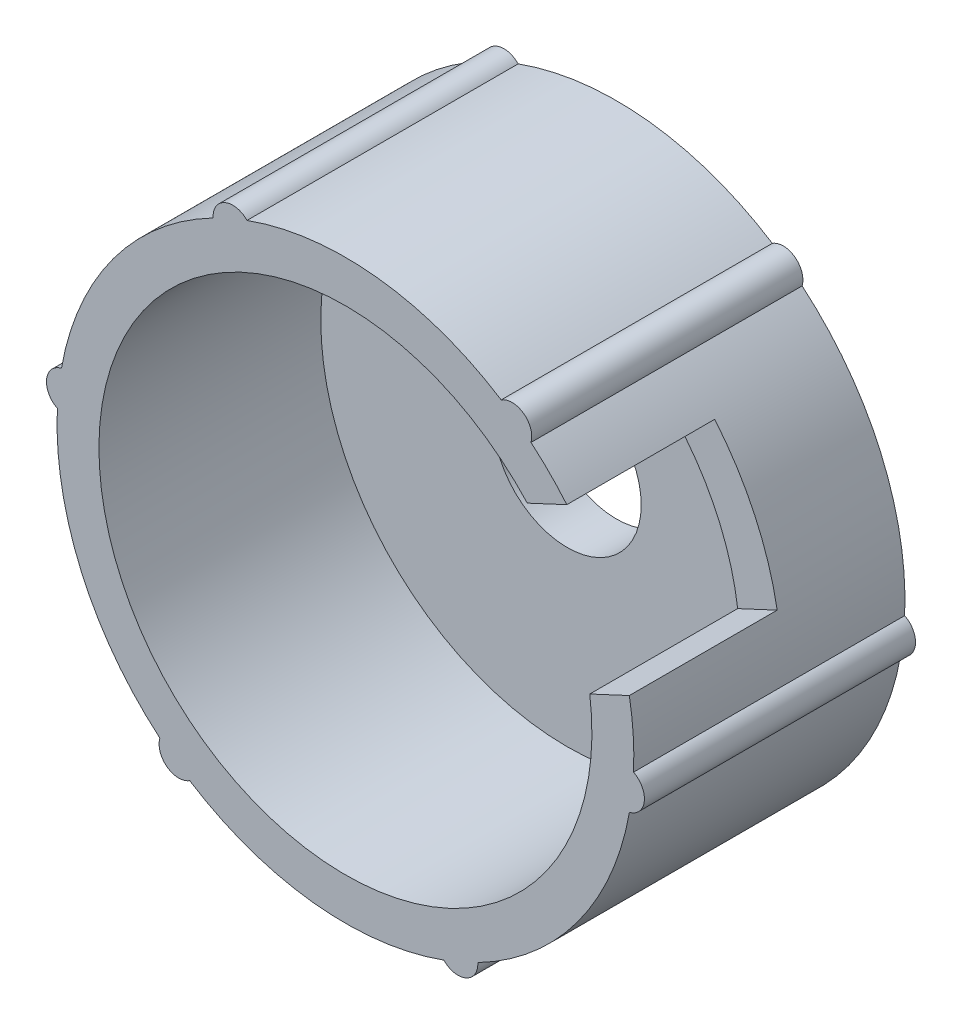
ISO-10303-21;
HEADER;
FILE_DESCRIPTION(('STEP AP214'),'2;1');
FILE_NAME('part.step','',(''),(''),'','','');
FILE_SCHEMA(('AUTOMOTIVE_DESIGN { 1 0 10303 214 1 1 1 1 }'));
ENDSEC;
DATA;
#1=APPLICATION_CONTEXT('core data for automotive mechanical design processes');
#2=APPLICATION_PROTOCOL_DEFINITION('international standard','automotive_design',2000,#1);
#3=PRODUCT_CONTEXT('',#1,'mechanical');
#4=PRODUCT('Part','Part','',(#3));
#5=PRODUCT_RELATED_PRODUCT_CATEGORY('part','',(#4));
#6=PRODUCT_DEFINITION_FORMATION('','',#4);
#7=PRODUCT_DEFINITION_CONTEXT('part definition',#1,'design');
#8=PRODUCT_DEFINITION('design','',#6,#7);
#9=PRODUCT_DEFINITION_SHAPE('','',#8);
#10=(LENGTH_UNIT() NAMED_UNIT(*) SI_UNIT(.MILLI.,.METRE.));
#11=(NAMED_UNIT(*) PLANE_ANGLE_UNIT() SI_UNIT($,.RADIAN.));
#12=(NAMED_UNIT(*) SI_UNIT($,.STERADIAN.) SOLID_ANGLE_UNIT());
#13=UNCERTAINTY_MEASURE_WITH_UNIT(LENGTH_MEASURE(1.E-05),#10,'distance_accuracy_value','');
#14=(GEOMETRIC_REPRESENTATION_CONTEXT(3) GLOBAL_UNCERTAINTY_ASSIGNED_CONTEXT((#13)) GLOBAL_UNIT_ASSIGNED_CONTEXT((#10,
#11,#12)) REPRESENTATION_CONTEXT('',''));
#15=CARTESIAN_POINT('',(0.,0.,0.));
#16=DIRECTION('',(0.,0.,1.));
#17=DIRECTION('',(1.,0.,0.));
#18=AXIS2_PLACEMENT_3D('',#15,#16,#17);
#19=CARTESIAN_POINT('',(94.,7.,29.9462986797652));
#20=DIRECTION('',(0.,0.,-1.));
#21=DIRECTION('',(-1.,0.,0.));
#22=AXIS2_PLACEMENT_3D('',#19,#20,#21);
#23=CYLINDRICAL_SURFACE('',#22,5.85);
#24=CARTESIAN_POINT('',(94.,7.,13.4));
#25=DIRECTION('',(0.,0.,1.));
#26=DIRECTION('',(1.,0.,0.));
#27=AXIS2_PLACEMENT_3D('',#24,#25,#26);
#28=CIRCLE('',#27,5.85);
#29=CARTESIAN_POINT('',(98.4907202465297,10.7491241200323,13.4));
#30=VERTEX_POINT('',#29);
#31=CARTESIAN_POINT('',(97.7638133414404,11.4784159175757,13.4));
#32=VERTEX_POINT('',#31);
#33=EDGE_CURVE('E177',#30,#32,#28,.T.);
#34=ORIENTED_EDGE('',*,*,#33,.F.);
#35=DIRECTION('',(0.,0.,-1.));
#36=VECTOR('',#35,1.);
#37=CARTESIAN_POINT('',(98.4907202465297,10.7491241200323,29.9462986797652));
#38=LINE('',#37,#36);
#39=CARTESIAN_POINT('',(98.4907202465297,10.7491241200323,10.4));
#40=VERTEX_POINT('',#39);
#41=EDGE_CURVE('E216',#30,#40,#38,.T.);
#42=ORIENTED_EDGE('',*,*,#41,.T.);
#43=CARTESIAN_POINT('',(94.,7.,10.4));
#44=DIRECTION('',(0.,0.,-1.));
#45=DIRECTION('',(-1.,0.,0.));
#46=AXIS2_PLACEMENT_3D('',#43,#44,#45);
#47=CIRCLE('',#46,5.85);
#48=CARTESIAN_POINT('',(99.7585750317518,8.03020075892235,10.4));
#49=VERTEX_POINT('',#48);
#50=EDGE_CURVE('E168',#40,#49,#47,.T.);
#51=ORIENTED_EDGE('',*,*,#50,.T.);
#52=DIRECTION('',(0.,0.,-1.));
#53=VECTOR('',#52,1.);
#54=CARTESIAN_POINT('',(99.7585750317518,8.03020075892235,29.9462986797652));
#55=LINE('',#54,#53);
#56=CARTESIAN_POINT('',(99.7585750317519,8.03020075892235,13.4));
#57=VERTEX_POINT('',#56);
#58=EDGE_CURVE('E154',#49,#57,#55,.F.);
#59=ORIENTED_EDGE('',*,*,#58,.T.);
#60=CARTESIAN_POINT('',(99.8435773086738,6.72594847646342,13.4));
#61=VERTEX_POINT('',#60);
#62=EDGE_CURVE('E166',#61,#57,#28,.T.);
#63=ORIENTED_EDGE('',*,*,#62,.F.);
#64=DIRECTION('',(0.,0.,-1.));
#65=VECTOR('',#64,1.);
#66=CARTESIAN_POINT('',(99.8435773086738,6.72594847646342,10.65));
#67=LINE('',#66,#65);
#68=CARTESIAN_POINT('',(99.8435773086738,6.72594847646342,7.9));
#69=VERTEX_POINT('',#68);
#70=EDGE_CURVE('E258',#69,#61,#67,.F.);
#71=ORIENTED_EDGE('',*,*,#70,.F.);
#72=CARTESIAN_POINT('',(94.,7.,7.9));
#73=DIRECTION('',(0.,0.,1.));
#74=DIRECTION('',(1.,0.,0.));
#75=AXIS2_PLACEMENT_3D('',#72,#73,#74);
#76=CIRCLE('',#75,5.85);
#77=CARTESIAN_POINT('',(97.7638133414404,11.4784159175757,7.9));
#78=VERTEX_POINT('',#77);
#79=EDGE_CURVE('E197',#69,#78,#76,.T.);
#80=ORIENTED_EDGE('',*,*,#79,.T.);
#81=DIRECTION('',(0.,0.,-1.));
#82=VECTOR('',#81,1.);
#83=CARTESIAN_POINT('',(97.7638133414404,11.4784159175757,10.65));
#84=LINE('',#83,#82);
#85=EDGE_CURVE('E264',#32,#78,#84,.T.);
#86=ORIENTED_EDGE('',*,*,#85,.F.);
#87=EDGE_LOOP('',(#34,#42,#51,#59,#63,#71,#80,#86));
#88=FACE_BOUND('',#87,.T.);
#89=ADVANCED_FACE('F41',(#88),#23,.T.);
#90=DIRECTION('',(0.,0.,-1.));
#91=VECTOR('',#90,1.);
#92=CARTESIAN_POINT('',(97.1591242356654,11.9236606365215,10.65));
#93=LINE('',#92,#91);
#94=CARTESIAN_POINT('',(97.1591242356654,11.9236606365215,7.9));
#95=VERTEX_POINT('',#94);
#96=CARTESIAN_POINT('',(97.1591242356654,11.9236606365215,13.4));
#97=VERTEX_POINT('',#96);
#98=EDGE_CURVE('E262',#95,#97,#93,.F.);
#99=ORIENTED_EDGE('',*,*,#98,.F.);
#100=CARTESIAN_POINT('',(92.003484717387,12.498765927578,7.9));
#101=VERTEX_POINT('',#100);
#102=EDGE_CURVE('E189',#95,#101,#76,.T.);
#103=ORIENTED_EDGE('',*,*,#102,.T.);
#104=DIRECTION('',(0.,0.,-1.));
#105=VECTOR('',#104,1.);
#106=CARTESIAN_POINT('',(92.003484717387,12.498765927578,10.65));
#107=LINE('',#106,#105);
#108=CARTESIAN_POINT('',(92.003484717387,12.498765927578,13.4));
#109=VERTEX_POINT('',#108);
#110=EDGE_CURVE('E206',#109,#101,#107,.T.);
#111=ORIENTED_EDGE('',*,*,#110,.F.);
#112=EDGE_CURVE('E179',#97,#109,#28,.T.);
#113=ORIENTED_EDGE('',*,*,#112,.F.);
#114=EDGE_LOOP('',(#99,#103,#111,#113));
#115=FACE_BOUND('',#114,.T.);
#116=ADVANCED_FACE('F308',(#115),#23,.T.);
#117=DIRECTION('',(0.,0.,-1.));
#118=VECTOR('',#117,1.);
#119=CARTESIAN_POINT('',(99.7603286240533,5.97964998999768,10.65));
#120=LINE('',#119,#118);
#121=CARTESIAN_POINT('',(99.7603286240533,5.97964998999768,13.4));
#122=VERTEX_POINT('',#121);
#123=CARTESIAN_POINT('',(99.7603286240533,5.97964998999768,7.9));
#124=VERTEX_POINT('',#123);
#125=EDGE_CURVE('E260',#122,#124,#120,.T.);
#126=ORIENTED_EDGE('',*,*,#125,.F.);
#127=CARTESIAN_POINT('',(96.6844530730084,1.80228783994192,13.4));
#128=VERTEX_POINT('',#127);
#129=EDGE_CURVE('E176',#128,#122,#28,.T.);
#130=ORIENTED_EDGE('',*,*,#129,.F.);
#131=DIRECTION('',(0.,0.,-1.));
#132=VECTOR('',#131,1.);
#133=CARTESIAN_POINT('',(96.6844530730084,1.80228783994192,10.65));
#134=LINE('',#133,#132);
#135=CARTESIAN_POINT('',(96.6844530730084,1.80228783994192,7.9));
#136=VERTEX_POINT('',#135);
#137=EDGE_CURVE('E253',#136,#128,#134,.F.);
#138=ORIENTED_EDGE('',*,*,#137,.F.);
#139=EDGE_CURVE('E205',#136,#124,#76,.T.);
#140=ORIENTED_EDGE('',*,*,#139,.T.);
#141=EDGE_LOOP('',(#126,#130,#138,#140));
#142=FACE_BOUND('',#141,.T.);
#143=ADVANCED_FACE('F300',(#142),#23,.T.);
#144=DIRECTION('',(0.,0.,-1.));
#145=VECTOR('',#144,1.);
#146=CARTESIAN_POINT('',(95.996515282613,1.501234072422,10.65));
#147=LINE('',#146,#145);
#148=CARTESIAN_POINT('',(95.996515282613,1.501234072422,13.4));
#149=VERTEX_POINT('',#148);
#150=CARTESIAN_POINT('',(95.996515282613,1.501234072422,7.9));
#151=VERTEX_POINT('',#150);
#152=EDGE_CURVE('E256',#149,#151,#147,.T.);
#153=ORIENTED_EDGE('',*,*,#152,.F.);
#154=CARTESIAN_POINT('',(90.8408757643346,2.0763393634785,13.4));
#155=VERTEX_POINT('',#154);
#156=EDGE_CURVE('E180',#155,#149,#28,.T.);
#157=ORIENTED_EDGE('',*,*,#156,.F.);
#158=DIRECTION('',(0.,0.,-1.));
#159=VECTOR('',#158,1.);
#160=CARTESIAN_POINT('',(90.8408757643346,2.07633936347851,10.65));
#161=LINE('',#160,#159);
#162=CARTESIAN_POINT('',(90.8408757643346,2.07633936347851,7.9));
#163=VERTEX_POINT('',#162);
#164=EDGE_CURVE('E248',#163,#155,#161,.F.);
#165=ORIENTED_EDGE('',*,*,#164,.F.);
#166=EDGE_CURVE('E195',#163,#151,#76,.T.);
#167=ORIENTED_EDGE('',*,*,#166,.T.);
#168=EDGE_LOOP('',(#153,#157,#165,#167));
#169=FACE_BOUND('',#168,.T.);
#170=ADVANCED_FACE('F285',(#169),#23,.T.);
#171=DIRECTION('',(0.,0.,-1.));
#172=VECTOR('',#171,1.);
#173=CARTESIAN_POINT('',(90.2361866585596,2.52158408242433,10.65));
#174=LINE('',#173,#172);
#175=CARTESIAN_POINT('',(90.2361866585596,2.52158408242433,13.4));
#176=VERTEX_POINT('',#175);
#177=CARTESIAN_POINT('',(90.2361866585596,2.52158408242433,7.9));
#178=VERTEX_POINT('',#177);
#179=EDGE_CURVE('E251',#176,#178,#174,.T.);
#180=ORIENTED_EDGE('',*,*,#179,.F.);
#181=CARTESIAN_POINT('',(88.1564226913262,7.27405152353661,13.4));
#182=VERTEX_POINT('',#181);
#183=EDGE_CURVE('E277',#182,#176,#28,.T.);
#184=ORIENTED_EDGE('',*,*,#183,.F.);
#185=DIRECTION('',(0.,0.,-1.));
#186=VECTOR('',#185,1.);
#187=CARTESIAN_POINT('',(88.1564226913262,7.27405152353662,10.65));
#188=LINE('',#187,#186);
#189=CARTESIAN_POINT('',(88.1564226913262,7.27405152353662,7.9));
#190=VERTEX_POINT('',#189);
#191=EDGE_CURVE('E229',#190,#182,#188,.F.);
#192=ORIENTED_EDGE('',*,*,#191,.F.);
#193=EDGE_CURVE('E188',#190,#178,#76,.T.);
#194=ORIENTED_EDGE('',*,*,#193,.T.);
#195=EDGE_LOOP('',(#180,#184,#192,#194));
#196=FACE_BOUND('',#195,.T.);
#197=ADVANCED_FACE('F316',(#196),#23,.T.);
#198=DIRECTION('',(0.,0.,-1.));
#199=VECTOR('',#198,1.);
#200=CARTESIAN_POINT('',(88.2396713759467,8.02035001000236,10.65));
#201=LINE('',#200,#199);
#202=CARTESIAN_POINT('',(88.2396713759467,8.02035001000236,13.4));
#203=VERTEX_POINT('',#202);
#204=CARTESIAN_POINT('',(88.2396713759467,8.02035001000236,7.9));
#205=VERTEX_POINT('',#204);
#206=EDGE_CURVE('E246',#203,#205,#201,.T.);
#207=ORIENTED_EDGE('',*,*,#206,.F.);
#208=CARTESIAN_POINT('',(91.3155469269916,12.1977121600581,13.4));
#209=VERTEX_POINT('',#208);
#210=EDGE_CURVE('E181',#209,#203,#28,.T.);
#211=ORIENTED_EDGE('',*,*,#210,.F.);
#212=DIRECTION('',(0.,0.,-1.));
#213=VECTOR('',#212,1.);
#214=CARTESIAN_POINT('',(91.3155469269916,12.1977121600581,10.65));
#215=LINE('',#214,#213);
#216=CARTESIAN_POINT('',(91.3155469269916,12.1977121600581,7.9));
#217=VERTEX_POINT('',#216);
#218=EDGE_CURVE('E209',#217,#209,#215,.F.);
#219=ORIENTED_EDGE('',*,*,#218,.F.);
#220=EDGE_CURVE('E184',#217,#205,#76,.T.);
#221=ORIENTED_EDGE('',*,*,#220,.T.);
#222=EDGE_LOOP('',(#207,#211,#219,#221));
#223=FACE_BOUND('',#222,.T.);
#224=ADVANCED_FACE('F276',(#223),#23,.T.);
#225=CARTESIAN_POINT('',(0.,0.,8.9));
#226=DIRECTION('',(0.,0.,1.));
#227=DIRECTION('',(1.,0.,0.));
#228=AXIS2_PLACEMENT_3D('',#225,#226,#227);
#229=PLANE('',#228);
#230=CARTESIAN_POINT('',(94.,7.,8.9));
#231=DIRECTION('',(0.,0.,1.));
#232=DIRECTION('',(1.,0.,0.));
#233=AXIS2_PLACEMENT_3D('',#230,#231,#232);
#234=CIRCLE('',#233,1.5);
#235=CARTESIAN_POINT('',(95.5,7.,8.9));
#236=VERTEX_POINT('',#235);
#237=EDGE_CURVE('E481',#236,#236,#234,.F.);
#238=ORIENTED_EDGE('',*,*,#237,.T.);
#239=EDGE_LOOP('',(#238));
#240=FACE_BOUND('',#239,.T.);
#241=CARTESIAN_POINT('',(94.,7.,8.9));
#242=DIRECTION('',(0.,0.,1.));
#243=DIRECTION('',(1.,0.,0.));
#244=AXIS2_PLACEMENT_3D('',#241,#242,#243);
#245=CIRCLE('',#244,4.99999999999999);
#246=CARTESIAN_POINT('',(99.,7.,8.9));
#247=VERTEX_POINT('',#246);
#248=EDGE_CURVE('E159',#247,#247,#245,.F.);
#249=ORIENTED_EDGE('',*,*,#248,.F.);
#250=EDGE_LOOP('',(#249));
#251=FACE_BOUND('',#250,.T.);
#252=ADVANCED_FACE('F334',(#240,#251),#229,.T.);
#253=CARTESIAN_POINT('',(94.,7.,29.9462986797652));
#254=DIRECTION('',(0.,0.,-1.));
#255=DIRECTION('',(-1.,0.,0.));
#256=AXIS2_PLACEMENT_3D('',#253,#254,#255);
#257=CYLINDRICAL_SURFACE('',#256,4.99999999999999);
#258=DIRECTION('',(0.,0.,-1.));
#259=VECTOR('',#258,1.);
#260=CARTESIAN_POINT('',(97.6888852404074,10.3752223161007,29.9462986797652));
#261=LINE('',#260,#259);
#262=CARTESIAN_POINT('',(97.6888852404074,10.3752223161007,13.4));
#263=VERTEX_POINT('',#262);
#264=CARTESIAN_POINT('',(97.6888852404074,10.3752223161007,10.4));
#265=VERTEX_POINT('',#264);
#266=EDGE_CURVE('E169',#263,#265,#261,.T.);
#267=ORIENTED_EDGE('',*,*,#266,.F.);
#268=CARTESIAN_POINT('',(94.,7.,13.4));
#269=DIRECTION('',(0.,0.,1.));
#270=DIRECTION('',(1.,0.,0.));
#271=AXIS2_PLACEMENT_3D('',#268,#269,#270);
#272=CIRCLE('',#271,4.99999999999999);
#273=CARTESIAN_POINT('',(98.9567400256295,7.65629895499074,13.4));
#274=VERTEX_POINT('',#273);
#275=EDGE_CURVE('E198',#263,#274,#272,.T.);
#276=ORIENTED_EDGE('',*,*,#275,.T.);
#277=DIRECTION('',(0.,0.,-1.));
#278=VECTOR('',#277,1.);
#279=CARTESIAN_POINT('',(98.9567400256295,7.65629895499075,29.9462986797652));
#280=LINE('',#279,#278);
#281=CARTESIAN_POINT('',(98.9567400256295,7.65629895499075,10.4));
#282=VERTEX_POINT('',#281);
#283=EDGE_CURVE('E56',#282,#274,#280,.F.);
#284=ORIENTED_EDGE('',*,*,#283,.F.);
#285=CARTESIAN_POINT('',(94.,7.,10.4));
#286=DIRECTION('',(0.,0.,-1.));
#287=DIRECTION('',(-1.,0.,0.));
#288=AXIS2_PLACEMENT_3D('',#285,#286,#287);
#289=CIRCLE('',#288,4.99999999999999);
#290=EDGE_CURVE('E11',#265,#282,#289,.T.);
#291=ORIENTED_EDGE('',*,*,#290,.F.);
#292=EDGE_LOOP('',(#267,#276,#284,#291));
#293=FACE_BOUND('',#292,.T.);
#294=ORIENTED_EDGE('',*,*,#248,.T.);
#295=EDGE_LOOP('',(#294));
#296=FACE_BOUND('',#295,.T.);
#297=ADVANCED_FACE('F218',(#293,#296),#257,.F.);
#298=CARTESIAN_POINT('',(0.,0.,13.4));
#299=DIRECTION('',(0.,0.,1.));
#300=DIRECTION('',(1.,0.,0.));
#301=AXIS2_PLACEMENT_3D('',#298,#299,#300);
#302=PLANE('',#301);
#303=DIRECTION('',(-0.906307787036647,-0.422618261740705,0.));
#304=VECTOR('',#303,1.);
#305=CARTESIAN_POINT('',(13.4738994012056,-28.8948705121345,13.4));
#306=LINE('',#305,#304);
#307=EDGE_CURVE('E49',#30,#263,#306,.T.);
#308=ORIENTED_EDGE('',*,*,#307,.F.);
#309=ORIENTED_EDGE('',*,*,#33,.T.);
#310=CARTESIAN_POINT('',(97.3796813324844,11.5899623191108,13.4));
#311=DIRECTION('',(0.,0.,1.));
#312=DIRECTION('',(1.,0.,0.));
#313=AXIS2_PLACEMENT_3D('',#310,#311,#312);
#314=CIRCLE('',#313,0.399999999999991);
#315=EDGE_CURVE('E64',#32,#97,#314,.T.);
#316=ORIENTED_EDGE('',*,*,#315,.T.);
#317=ORIENTED_EDGE('',*,*,#112,.T.);
#318=CARTESIAN_POINT('',(91.7148166954789,12.2218710501829,13.4));
#319=DIRECTION('',(0.,0.,1.));
#320=DIRECTION('',(1.,0.,0.));
#321=AXIS2_PLACEMENT_3D('',#318,#319,#320);
#322=CIRCLE('',#321,0.399999999999991);
#323=EDGE_CURVE('E268',#109,#209,#322,.T.);
#324=ORIENTED_EDGE('',*,*,#323,.T.);
#325=ORIENTED_EDGE('',*,*,#210,.T.);
#326=CARTESIAN_POINT('',(88.3351353629946,7.63190873107218,13.4));
#327=DIRECTION('',(0.,0.,1.));
#328=DIRECTION('',(1.,0.,0.));
#329=AXIS2_PLACEMENT_3D('',#326,#327,#328);
#330=CIRCLE('',#329,0.399999999999991);
#331=EDGE_CURVE('E240',#203,#182,#330,.T.);
#332=ORIENTED_EDGE('',*,*,#331,.T.);
#333=ORIENTED_EDGE('',*,*,#183,.T.);
#334=CARTESIAN_POINT('',(90.6203186675156,2.41003768088927,13.4));
#335=DIRECTION('',(0.,0.,1.));
#336=DIRECTION('',(1.,0.,0.));
#337=AXIS2_PLACEMENT_3D('',#334,#335,#336);
#338=CIRCLE('',#337,0.399999999999991);
#339=EDGE_CURVE('E236',#176,#155,#338,.T.);
#340=ORIENTED_EDGE('',*,*,#339,.T.);
#341=ORIENTED_EDGE('',*,*,#156,.T.);
#342=CARTESIAN_POINT('',(96.2851833045211,1.77812894981712,13.4));
#343=DIRECTION('',(0.,0.,1.));
#344=DIRECTION('',(1.,0.,0.));
#345=AXIS2_PLACEMENT_3D('',#342,#343,#344);
#346=CIRCLE('',#345,0.399999999999991);
#347=EDGE_CURVE('E232',#149,#128,#346,.T.);
#348=ORIENTED_EDGE('',*,*,#347,.T.);
#349=ORIENTED_EDGE('',*,*,#129,.T.);
#350=CARTESIAN_POINT('',(99.6648646370054,6.36809126892786,13.4));
#351=DIRECTION('',(0.,0.,1.));
#352=DIRECTION('',(1.,0.,0.));
#353=AXIS2_PLACEMENT_3D('',#350,#351,#352);
#354=CIRCLE('',#353,0.399999999999991);
#355=EDGE_CURVE('E174',#122,#61,#354,.T.);
#356=ORIENTED_EDGE('',*,*,#355,.T.);
#357=ORIENTED_EDGE('',*,*,#62,.T.);
#358=DIRECTION('',(0.906307787036648,0.422618261740704,0.));
#359=VECTOR('',#358,1.);
#360=CARTESIAN_POINT('',(14.7417541864276,-31.6137938732444,13.4));
#361=LINE('',#360,#359);
#362=EDGE_CURVE('E151',#274,#57,#361,.T.);
#363=ORIENTED_EDGE('',*,*,#362,.F.);
#364=ORIENTED_EDGE('',*,*,#275,.F.);
#365=EDGE_LOOP('',(#308,#309,#316,#317,#324,#325,#332,#333,#340,#341,#348,#349,#356,#357,#363,#364));
#366=FACE_BOUND('',#365,.T.);
#367=ADVANCED_FACE('F172',(#366),#302,.T.);
#368=CARTESIAN_POINT('',(0.,0.,7.9));
#369=DIRECTION('',(0.,0.,1.));
#370=DIRECTION('',(1.,0.,0.));
#371=AXIS2_PLACEMENT_3D('',#368,#369,#370);
#372=PLANE('',#371);
#373=CARTESIAN_POINT('',(94.,7.,7.9));
#374=DIRECTION('',(0.,0.,1.));
#375=DIRECTION('',(1.,0.,0.));
#376=AXIS2_PLACEMENT_3D('',#373,#374,#375);
#377=CIRCLE('',#376,1.5);
#378=CARTESIAN_POINT('',(95.5,7.,7.9));
#379=VERTEX_POINT('',#378);
#380=EDGE_CURVE('E484',#379,#379,#377,.T.);
#381=ORIENTED_EDGE('',*,*,#380,.T.);
#382=EDGE_LOOP('',(#381));
#383=FACE_BOUND('',#382,.T.);
#384=ORIENTED_EDGE('',*,*,#102,.F.);
#385=CARTESIAN_POINT('',(97.3796813324844,11.5899623191108,7.9));
#386=DIRECTION('',(0.,0.,1.));
#387=DIRECTION('',(0.499999999999998,-0.86602540378444,0.));
#388=AXIS2_PLACEMENT_3D('',#385,#386,#387);
#389=CIRCLE('',#388,0.399999999999991);
#390=EDGE_CURVE('E226',#78,#95,#389,.T.);
#391=ORIENTED_EDGE('',*,*,#390,.F.);
#392=ORIENTED_EDGE('',*,*,#79,.F.);
#393=CARTESIAN_POINT('',(99.6648646370054,6.36809126892786,7.9));
#394=DIRECTION('',(0.,0.,1.));
#395=DIRECTION('',(-0.500000000000004,-0.866025403784436,0.));
#396=AXIS2_PLACEMENT_3D('',#393,#394,#395);
#397=CIRCLE('',#396,0.399999999999991);
#398=EDGE_CURVE('E230',#124,#69,#397,.T.);
#399=ORIENTED_EDGE('',*,*,#398,.F.);
#400=ORIENTED_EDGE('',*,*,#139,.F.);
#401=CARTESIAN_POINT('',(96.2851833045211,1.77812894981712,7.9));
#402=DIRECTION('',(0.,0.,1.));
#403=DIRECTION('',(-1.,0.,0.));
#404=AXIS2_PLACEMENT_3D('',#401,#402,#403);
#405=CIRCLE('',#404,0.399999999999991);
#406=EDGE_CURVE('E234',#151,#136,#405,.T.);
#407=ORIENTED_EDGE('',*,*,#406,.F.);
#408=ORIENTED_EDGE('',*,*,#166,.F.);
#409=CARTESIAN_POINT('',(90.6203186675156,2.41003768088927,7.9));
#410=DIRECTION('',(0.,0.,1.));
#411=DIRECTION('',(-0.499999999999992,0.866025403784443,0.));
#412=AXIS2_PLACEMENT_3D('',#409,#410,#411);
#413=CIRCLE('',#412,0.399999999999991);
#414=EDGE_CURVE('E238',#178,#163,#413,.T.);
#415=ORIENTED_EDGE('',*,*,#414,.F.);
#416=ORIENTED_EDGE('',*,*,#193,.F.);
#417=CARTESIAN_POINT('',(88.3351353629946,7.63190873107218,7.9));
#418=DIRECTION('',(0.,0.,1.));
#419=DIRECTION('',(0.50000000000001,0.866025403784433,0.));
#420=AXIS2_PLACEMENT_3D('',#417,#418,#419);
#421=CIRCLE('',#420,0.399999999999991);
#422=EDGE_CURVE('E225',#205,#190,#421,.T.);
#423=ORIENTED_EDGE('',*,*,#422,.F.);
#424=ORIENTED_EDGE('',*,*,#220,.F.);
#425=CARTESIAN_POINT('',(91.7148166954789,12.2218710501829,7.9));
#426=DIRECTION('',(0.,0.,1.));
#427=DIRECTION('',(1.,0.,0.));
#428=AXIS2_PLACEMENT_3D('',#425,#426,#427);
#429=CIRCLE('',#428,0.399999999999991);
#430=EDGE_CURVE('E266',#101,#217,#429,.T.);
#431=ORIENTED_EDGE('',*,*,#430,.F.);
#432=EDGE_LOOP('',(#384,#391,#392,#399,#400,#407,#408,#415,#416,#423,#424,#431));
#433=FACE_BOUND('',#432,.T.);
#434=ADVANCED_FACE('F43',(#383,#433),#372,.F.);
#435=CARTESIAN_POINT('',(91.7148166954789,12.2218710501829,14.5313708498985));
#436=DIRECTION('',(0.,0.,-1.));
#437=DIRECTION('',(-1.,0.,0.));
#438=AXIS2_PLACEMENT_3D('',#435,#436,#437);
#439=CYLINDRICAL_SURFACE('',#438,0.399999999999991);
#440=ORIENTED_EDGE('',*,*,#323,.F.);
#441=ORIENTED_EDGE('',*,*,#110,.T.);
#442=ORIENTED_EDGE('',*,*,#430,.T.);
#443=ORIENTED_EDGE('',*,*,#218,.T.);
#444=EDGE_LOOP('',(#440,#441,#442,#443));
#445=FACE_BOUND('',#444,.T.);
#446=ADVANCED_FACE('F273',(#445),#439,.T.);
#447=CARTESIAN_POINT('',(88.3351353629946,7.63190873107218,14.5313708498985));
#448=DIRECTION('',(0.,0.,-1.));
#449=DIRECTION('',(-1.,0.,0.));
#450=AXIS2_PLACEMENT_3D('',#447,#448,#449);
#451=CYLINDRICAL_SURFACE('',#450,0.399999999999991);
#452=ORIENTED_EDGE('',*,*,#331,.F.);
#453=ORIENTED_EDGE('',*,*,#206,.T.);
#454=ORIENTED_EDGE('',*,*,#422,.T.);
#455=ORIENTED_EDGE('',*,*,#191,.T.);
#456=EDGE_LOOP('',(#452,#453,#454,#455));
#457=FACE_BOUND('',#456,.T.);
#458=ADVANCED_FACE('F313',(#457),#451,.T.);
#459=CARTESIAN_POINT('',(90.6203186675156,2.41003768088927,14.5313708498985));
#460=DIRECTION('',(0.,0.,-1.));
#461=DIRECTION('',(-1.,0.,0.));
#462=AXIS2_PLACEMENT_3D('',#459,#460,#461);
#463=CYLINDRICAL_SURFACE('',#462,0.399999999999991);
#464=ORIENTED_EDGE('',*,*,#339,.F.);
#465=ORIENTED_EDGE('',*,*,#179,.T.);
#466=ORIENTED_EDGE('',*,*,#414,.T.);
#467=ORIENTED_EDGE('',*,*,#164,.T.);
#468=EDGE_LOOP('',(#464,#465,#466,#467));
#469=FACE_BOUND('',#468,.T.);
#470=ADVANCED_FACE('F318',(#469),#463,.T.);
#471=CARTESIAN_POINT('',(96.2851833045211,1.77812894981712,14.5313708498985));
#472=DIRECTION('',(0.,0.,-1.));
#473=DIRECTION('',(-1.,0.,0.));
#474=AXIS2_PLACEMENT_3D('',#471,#472,#473);
#475=CYLINDRICAL_SURFACE('',#474,0.399999999999991);
#476=ORIENTED_EDGE('',*,*,#347,.F.);
#477=ORIENTED_EDGE('',*,*,#152,.T.);
#478=ORIENTED_EDGE('',*,*,#406,.T.);
#479=ORIENTED_EDGE('',*,*,#137,.T.);
#480=EDGE_LOOP('',(#476,#477,#478,#479));
#481=FACE_BOUND('',#480,.T.);
#482=ADVANCED_FACE('F290',(#481),#475,.T.);
#483=CARTESIAN_POINT('',(99.6648646370054,6.36809126892786,14.5313708498985));
#484=DIRECTION('',(0.,0.,-1.));
#485=DIRECTION('',(-1.,0.,0.));
#486=AXIS2_PLACEMENT_3D('',#483,#484,#485);
#487=CYLINDRICAL_SURFACE('',#486,0.399999999999991);
#488=ORIENTED_EDGE('',*,*,#355,.F.);
#489=ORIENTED_EDGE('',*,*,#125,.T.);
#490=ORIENTED_EDGE('',*,*,#398,.T.);
#491=ORIENTED_EDGE('',*,*,#70,.T.);
#492=EDGE_LOOP('',(#488,#489,#490,#491));
#493=FACE_BOUND('',#492,.T.);
#494=ADVANCED_FACE('F303',(#493),#487,.T.);
#495=CARTESIAN_POINT('',(97.3796813324844,11.5899623191108,14.5313708498985));
#496=DIRECTION('',(0.,0.,-1.));
#497=DIRECTION('',(-1.,0.,0.));
#498=AXIS2_PLACEMENT_3D('',#495,#496,#497);
#499=CYLINDRICAL_SURFACE('',#498,0.399999999999991);
#500=ORIENTED_EDGE('',*,*,#315,.F.);
#501=ORIENTED_EDGE('',*,*,#85,.T.);
#502=ORIENTED_EDGE('',*,*,#390,.T.);
#503=ORIENTED_EDGE('',*,*,#98,.T.);
#504=EDGE_LOOP('',(#500,#501,#502,#503));
#505=FACE_BOUND('',#504,.T.);
#506=ADVANCED_FACE('F307',(#505),#499,.T.);
#507=CARTESIAN_POINT('',(0.,0.,10.4));
#508=DIRECTION('',(0.,0.,-1.));
#509=DIRECTION('',(-1.,0.,0.));
#510=AXIS2_PLACEMENT_3D('',#507,#508,#509);
#511=PLANE('',#510);
#512=DIRECTION('',(-0.906307787036647,-0.422618261740705,0.));
#513=VECTOR('',#512,1.);
#514=CARTESIAN_POINT('',(93.366072607389,8.35946168055497,10.4));
#515=LINE('',#514,#513);
#516=EDGE_CURVE('E490',#40,#265,#515,.T.);
#517=ORIENTED_EDGE('',*,*,#516,.T.);
#518=ORIENTED_EDGE('',*,*,#290,.T.);
#519=DIRECTION('',(0.906307787036648,0.422618261740704,0.));
#520=VECTOR('',#519,1.);
#521=CARTESIAN_POINT('',(101.558616228216,8.86957375382815,10.4));
#522=LINE('',#521,#520);
#523=EDGE_CURVE('E486',#282,#49,#522,.T.);
#524=ORIENTED_EDGE('',*,*,#523,.T.);
#525=ORIENTED_EDGE('',*,*,#50,.F.);
#526=EDGE_LOOP('',(#517,#518,#524,#525));
#527=FACE_BOUND('',#526,.T.);
#528=ADVANCED_FACE('F378',(#527),#511,.F.);
#529=CARTESIAN_POINT('',(93.366072607389,8.35946168055497,10.4));
#530=DIRECTION('',(-0.422618261740705,0.906307787036647,0.));
#531=DIRECTION('',(-0.906307787036647,-0.422618261740705,0.));
#532=AXIS2_PLACEMENT_3D('',#529,#530,#531);
#533=PLANE('',#532);
#534=ORIENTED_EDGE('',*,*,#307,.T.);
#535=ORIENTED_EDGE('',*,*,#266,.T.);
#536=ORIENTED_EDGE('',*,*,#516,.F.);
#537=ORIENTED_EDGE('',*,*,#41,.F.);
#538=EDGE_LOOP('',(#534,#535,#536,#537));
#539=FACE_BOUND('',#538,.T.);
#540=ADVANCED_FACE('F213',(#539),#533,.F.);
#541=CARTESIAN_POINT('',(101.558616228216,8.86957375382815,10.4));
#542=DIRECTION('',(0.422618261740704,-0.906307787036648,0.));
#543=DIRECTION('',(0.906307787036648,0.422618261740704,0.));
#544=AXIS2_PLACEMENT_3D('',#541,#542,#543);
#545=PLANE('',#544);
#546=ORIENTED_EDGE('',*,*,#523,.F.);
#547=ORIENTED_EDGE('',*,*,#283,.T.);
#548=ORIENTED_EDGE('',*,*,#362,.T.);
#549=ORIENTED_EDGE('',*,*,#58,.F.);
#550=EDGE_LOOP('',(#546,#547,#548,#549));
#551=FACE_BOUND('',#550,.T.);
#552=ADVANCED_FACE('F153',(#551),#545,.F.);
#553=CARTESIAN_POINT('',(94.,7.,13.4));
#554=DIRECTION('',(0.,0.,-1.));
#555=DIRECTION('',(-1.,0.,0.));
#556=AXIS2_PLACEMENT_3D('',#553,#554,#555);
#557=CYLINDRICAL_SURFACE('',#556,1.5);
#558=ORIENTED_EDGE('',*,*,#237,.F.);
#559=EDGE_LOOP('',(#558));
#560=FACE_BOUND('',#559,.T.);
#561=ORIENTED_EDGE('',*,*,#380,.F.);
#562=EDGE_LOOP('',(#561));
#563=FACE_BOUND('',#562,.T.);
#564=ADVANCED_FACE('F437',(#560,#563),#557,.F.);
#565=CLOSED_SHELL('',(#89,#116,#143,#170,#197,#224,#252,#297,#367,#434,#446,#458,#470,#482,#494,
#506,#528,#540,#552,#564));
#566=MANIFOLD_SOLID_BREP('B2',#565);
#567=ADVANCED_BREP_SHAPE_REPRESENTATION('',(#18,#566),#14);
#568=SHAPE_DEFINITION_REPRESENTATION(#9,#567);
ENDSEC;
END-ISO-10303-21;
